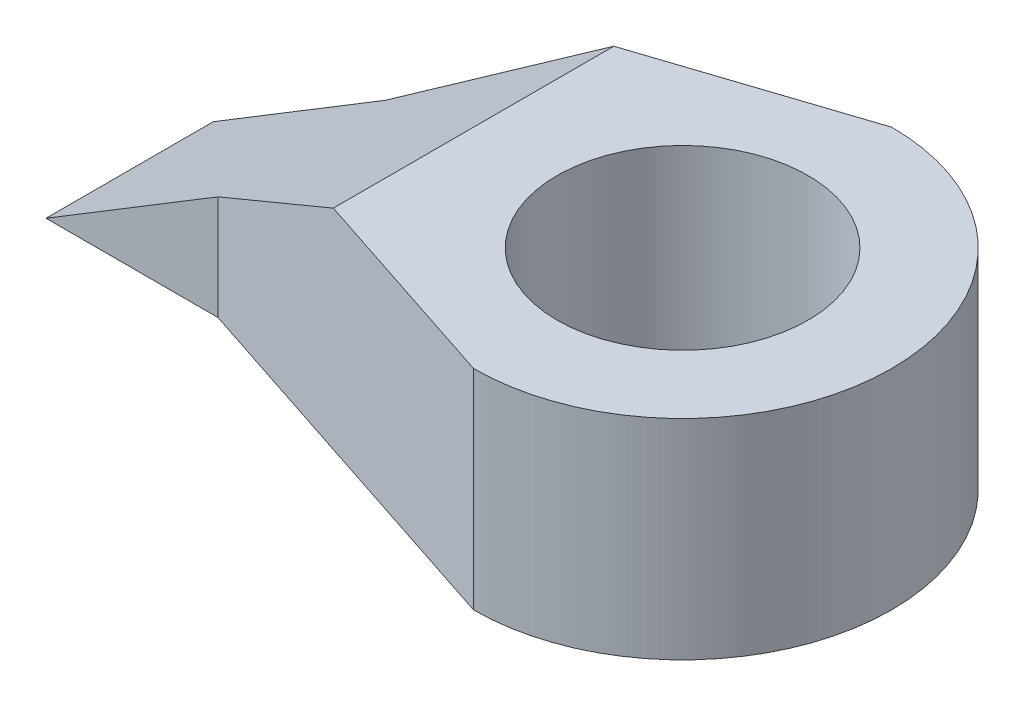
ISO-10303-21;
HEADER;
FILE_DESCRIPTION(('STEP AP214'),'2;1');
FILE_NAME('part.step','',(''),(''),'','','');
FILE_SCHEMA(('AUTOMOTIVE_DESIGN { 1 0 10303 214 1 1 1 1 }'));
ENDSEC;
DATA;
#1=APPLICATION_CONTEXT('core data for automotive mechanical design processes');
#2=APPLICATION_PROTOCOL_DEFINITION('international standard','automotive_design',2000,#1);
#3=PRODUCT_CONTEXT('',#1,'mechanical');
#4=PRODUCT('Part','Part','',(#3));
#5=PRODUCT_RELATED_PRODUCT_CATEGORY('part','',(#4));
#6=PRODUCT_DEFINITION_FORMATION('','',#4);
#7=PRODUCT_DEFINITION_CONTEXT('part definition',#1,'design');
#8=PRODUCT_DEFINITION('design','',#6,#7);
#9=PRODUCT_DEFINITION_SHAPE('','',#8);
#10=(LENGTH_UNIT() NAMED_UNIT(*) SI_UNIT(.MILLI.,.METRE.));
#11=(NAMED_UNIT(*) PLANE_ANGLE_UNIT() SI_UNIT($,.RADIAN.));
#12=(NAMED_UNIT(*) SI_UNIT($,.STERADIAN.) SOLID_ANGLE_UNIT());
#13=UNCERTAINTY_MEASURE_WITH_UNIT(LENGTH_MEASURE(1.E-05),#10,'distance_accuracy_value','');
#14=(GEOMETRIC_REPRESENTATION_CONTEXT(3) GLOBAL_UNCERTAINTY_ASSIGNED_CONTEXT((#13)) GLOBAL_UNIT_ASSIGNED_CONTEXT((#10,
#11,#12)) REPRESENTATION_CONTEXT('',''));
#15=CARTESIAN_POINT('',(0.,0.,0.));
#16=DIRECTION('',(0.,0.,1.));
#17=DIRECTION('',(1.,0.,0.));
#18=AXIS2_PLACEMENT_3D('',#15,#16,#17);
#19=CARTESIAN_POINT('',(13.2266009852217,5.,7.));
#20=DIRECTION('',(0.312682848974804,0.,-0.949857587197681));
#21=DIRECTION('',(-0.949857587197681,0.,-0.312682848974804));
#22=AXIS2_PLACEMENT_3D('',#19,#20,#21);
#23=PLANE('',#22);
#24=DIRECTION('',(-0.822615623796339,-0.499972968954063,-0.270796170211876));
#25=VECTOR('',#24,1.);
#26=CARTESIAN_POINT('',(8.59347657538926,5.22298127186832,5.47482553211462));
#27=LINE('',#26,#25);
#28=CARTESIAN_POINT('',(8.22660098522168,5.,5.35405405405406));
#29=VERTEX_POINT('',#28);
#30=CARTESIAN_POINT('',(4.11330049261084,2.5,4.));
#31=VERTEX_POINT('',#30);
#32=EDGE_CURVE('E83',#29,#31,#27,.T.);
#33=ORIENTED_EDGE('',*,*,#32,.T.);
#34=DIRECTION('',(0.,1.,0.));
#35=VECTOR('',#34,1.);
#36=CARTESIAN_POINT('',(4.11330049261084,0.,4.));
#37=LINE('',#36,#35);
#38=CARTESIAN_POINT('',(4.11330049261084,0.,4.));
#39=VERTEX_POINT('',#38);
#40=EDGE_CURVE('E11',#39,#31,#37,.T.);
#41=ORIENTED_EDGE('',*,*,#40,.F.);
#42=DIRECTION('',(0.949857587197681,0.,0.312682848974804));
#43=VECTOR('',#42,1.);
#44=CARTESIAN_POINT('',(13.2266009852217,0.,7.));
#45=LINE('',#44,#43);
#46=CARTESIAN_POINT('',(13.2266009852217,0.,7.));
#47=VERTEX_POINT('',#46);
#48=EDGE_CURVE('E123',#39,#47,#45,.T.);
#49=ORIENTED_EDGE('',*,*,#48,.T.);
#50=DIRECTION('',(0.,-1.,0.));
#51=VECTOR('',#50,1.);
#52=CARTESIAN_POINT('',(13.2266009852217,5.,7.));
#53=LINE('',#52,#51);
#54=CARTESIAN_POINT('',(13.2266009852217,5.,7.));
#55=VERTEX_POINT('',#54);
#56=EDGE_CURVE('E135',#55,#47,#53,.T.);
#57=ORIENTED_EDGE('',*,*,#56,.F.);
#58=DIRECTION('',(0.949857587197681,0.,0.312682848974804));
#59=VECTOR('',#58,1.);
#60=CARTESIAN_POINT('',(13.2266009852217,5.,7.));
#61=LINE('',#60,#59);
#62=EDGE_CURVE('E86',#29,#55,#61,.T.);
#63=ORIENTED_EDGE('',*,*,#62,.F.);
#64=EDGE_LOOP('',(#33,#41,#49,#57,#63));
#65=FACE_BOUND('',#64,.T.);
#66=ADVANCED_FACE('F33',(#65),#23,.F.);
#67=CARTESIAN_POINT('',(13.2266009852217,5.,2.));
#68=DIRECTION('',(0.,1.,0.));
#69=DIRECTION('',(0.,0.,1.));
#70=AXIS2_PLACEMENT_3D('',#67,#68,#69);
#71=PLANE('',#70);
#72=CARTESIAN_POINT('',(13.2266009852217,5.,2.));
#73=DIRECTION('',(0.,1.,0.));
#74=DIRECTION('',(0.,0.,1.));
#75=AXIS2_PLACEMENT_3D('',#72,#73,#74);
#76=CIRCLE('',#75,3.);
#77=CARTESIAN_POINT('',(13.2266009852217,5.,5.));
#78=VERTEX_POINT('',#77);
#79=EDGE_CURVE('E146',#78,#78,#76,.T.);
#80=ORIENTED_EDGE('',*,*,#79,.F.);
#81=EDGE_LOOP('',(#80));
#82=FACE_BOUND('',#81,.T.);
#83=DIRECTION('',(0.,0.,-1.));
#84=VECTOR('',#83,1.);
#85=CARTESIAN_POINT('',(8.22660098522168,5.,4.));
#86=LINE('',#85,#84);
#87=CARTESIAN_POINT('',(8.22660098522168,5.,-1.35405405405405));
#88=VERTEX_POINT('',#87);
#89=EDGE_CURVE('E98',#29,#88,#86,.T.);
#90=ORIENTED_EDGE('',*,*,#89,.F.);
#91=ORIENTED_EDGE('',*,*,#62,.T.);
#92=CARTESIAN_POINT('',(13.2266009852217,5.,2.));
#93=DIRECTION('',(0.,1.,0.));
#94=DIRECTION('',(0.,0.,1.));
#95=AXIS2_PLACEMENT_3D('',#92,#93,#94);
#96=CIRCLE('',#95,5.);
#97=CARTESIAN_POINT('',(13.2266009852217,5.,-3.));
#98=VERTEX_POINT('',#97);
#99=EDGE_CURVE('E127',#55,#98,#96,.T.);
#100=ORIENTED_EDGE('',*,*,#99,.T.);
#101=DIRECTION('',(-0.949857587197681,0.,0.312682848974804));
#102=VECTOR('',#101,1.);
#103=CARTESIAN_POINT('',(13.2266009852217,5.,-3.));
#104=LINE('',#103,#102);
#105=EDGE_CURVE('E130',#98,#88,#104,.T.);
#106=ORIENTED_EDGE('',*,*,#105,.T.);
#107=EDGE_LOOP('',(#90,#91,#100,#106));
#108=FACE_BOUND('',#107,.T.);
#109=ADVANCED_FACE('F153',(#82,#108),#71,.T.);
#110=CARTESIAN_POINT('',(13.2266009852217,5.,2.));
#111=DIRECTION('',(0.,-1.,0.));
#112=DIRECTION('',(0.,0.,-1.));
#113=AXIS2_PLACEMENT_3D('',#110,#111,#112);
#114=CYLINDRICAL_SURFACE('',#113,5.);
#115=CARTESIAN_POINT('',(13.2266009852217,0.,2.));
#116=DIRECTION('',(0.,1.,0.));
#117=DIRECTION('',(0.,0.,1.));
#118=AXIS2_PLACEMENT_3D('',#115,#116,#117);
#119=CIRCLE('',#118,5.);
#120=CARTESIAN_POINT('',(13.2266009852217,0.,-3.));
#121=VERTEX_POINT('',#120);
#122=EDGE_CURVE('E125',#47,#121,#119,.T.);
#123=ORIENTED_EDGE('',*,*,#122,.T.);
#124=DIRECTION('',(0.,-1.,0.));
#125=VECTOR('',#124,1.);
#126=CARTESIAN_POINT('',(13.2266009852217,5.,-3.));
#127=LINE('',#126,#125);
#128=EDGE_CURVE('E107',#98,#121,#127,.T.);
#129=ORIENTED_EDGE('',*,*,#128,.F.);
#130=ORIENTED_EDGE('',*,*,#99,.F.);
#131=ORIENTED_EDGE('',*,*,#56,.T.);
#132=EDGE_LOOP('',(#123,#129,#130,#131));
#133=FACE_BOUND('',#132,.T.);
#134=ADVANCED_FACE('F139',(#133),#114,.T.);
#135=CARTESIAN_POINT('',(13.2266009852217,5.,-3.));
#136=DIRECTION('',(0.312682848974804,0.,0.949857587197681));
#137=DIRECTION('',(0.949857587197681,0.,-0.312682848974804));
#138=AXIS2_PLACEMENT_3D('',#135,#136,#137);
#139=PLANE('',#138);
#140=DIRECTION('',(0.,1.,0.));
#141=VECTOR('',#140,1.);
#142=CARTESIAN_POINT('',(4.11330049261084,0.,0.));
#143=LINE('',#142,#141);
#144=CARTESIAN_POINT('',(4.11330049261084,0.,0.));
#145=VERTEX_POINT('',#144);
#146=CARTESIAN_POINT('',(4.11330049261084,2.5,0.));
#147=VERTEX_POINT('',#146);
#148=EDGE_CURVE('E42',#145,#147,#143,.T.);
#149=ORIENTED_EDGE('',*,*,#148,.T.);
#150=DIRECTION('',(-0.822615623796339,-0.499972968954063,0.270796170211876));
#151=VECTOR('',#150,1.);
#152=CARTESIAN_POINT('',(8.59347657538926,5.22298127186832,-1.47482553211462));
#153=LINE('',#152,#151);
#154=EDGE_CURVE('E88',#88,#147,#153,.T.);
#155=ORIENTED_EDGE('',*,*,#154,.F.);
#156=ORIENTED_EDGE('',*,*,#105,.F.);
#157=ORIENTED_EDGE('',*,*,#128,.T.);
#158=DIRECTION('',(-0.949857587197681,0.,0.312682848974804));
#159=VECTOR('',#158,1.);
#160=CARTESIAN_POINT('',(13.2266009852217,0.,-3.));
#161=LINE('',#160,#159);
#162=EDGE_CURVE('E117',#121,#145,#161,.T.);
#163=ORIENTED_EDGE('',*,*,#162,.T.);
#164=EDGE_LOOP('',(#149,#155,#156,#157,#163));
#165=FACE_BOUND('',#164,.T.);
#166=ADVANCED_FACE('F114',(#165),#139,.F.);
#167=CARTESIAN_POINT('',(0.,0.,4.));
#168=DIRECTION('',(0.,0.,1.));
#169=DIRECTION('',(1.,0.,0.));
#170=AXIS2_PLACEMENT_3D('',#167,#168,#169);
#171=PLANE('',#170);
#172=DIRECTION('',(1.,0.,0.));
#173=VECTOR('',#172,1.);
#174=CARTESIAN_POINT('',(8.22660098522168,0.,4.));
#175=LINE('',#174,#173);
#176=CARTESIAN_POINT('',(0.,0.,4.));
#177=VERTEX_POINT('',#176);
#178=EDGE_CURVE('E93',#177,#39,#175,.T.);
#179=ORIENTED_EDGE('',*,*,#178,.T.);
#180=ORIENTED_EDGE('',*,*,#40,.T.);
#181=DIRECTION('',(-0.85454420738555,-0.519378664967864,0.));
#182=VECTOR('',#181,1.);
#183=CARTESIAN_POINT('',(0.,0.,4.));
#184=LINE('',#183,#182);
#185=EDGE_CURVE('E47',#31,#177,#184,.T.);
#186=ORIENTED_EDGE('',*,*,#185,.T.);
#187=EDGE_LOOP('',(#179,#180,#186));
#188=FACE_BOUND('',#187,.T.);
#189=ADVANCED_FACE('F91',(#188),#171,.T.);
#190=CARTESIAN_POINT('',(0.,0.,0.));
#191=DIRECTION('',(0.,0.,1.));
#192=DIRECTION('',(1.,0.,0.));
#193=AXIS2_PLACEMENT_3D('',#190,#191,#192);
#194=PLANE('',#193);
#195=ORIENTED_EDGE('',*,*,#148,.F.);
#196=DIRECTION('',(1.,0.,0.));
#197=VECTOR('',#196,1.);
#198=CARTESIAN_POINT('',(8.22660098522168,0.,0.));
#199=LINE('',#198,#197);
#200=CARTESIAN_POINT('',(0.,0.,0.));
#201=VERTEX_POINT('',#200);
#202=EDGE_CURVE('E104',#201,#145,#199,.T.);
#203=ORIENTED_EDGE('',*,*,#202,.F.);
#204=DIRECTION('',(-0.85454420738555,-0.519378664967864,0.));
#205=VECTOR('',#204,1.);
#206=CARTESIAN_POINT('',(0.,0.,0.));
#207=LINE('',#206,#205);
#208=EDGE_CURVE('E100',#147,#201,#207,.T.);
#209=ORIENTED_EDGE('',*,*,#208,.F.);
#210=EDGE_LOOP('',(#195,#203,#209));
#211=FACE_BOUND('',#210,.T.);
#212=ADVANCED_FACE('F120',(#211),#194,.F.);
#213=CARTESIAN_POINT('',(8.22660098522168,0.,4.));
#214=DIRECTION('',(0.,1.,0.));
#215=DIRECTION('',(0.,0.,1.));
#216=AXIS2_PLACEMENT_3D('',#213,#214,#215);
#217=PLANE('',#216);
#218=CARTESIAN_POINT('',(13.2266009852217,0.,2.));
#219=DIRECTION('',(0.,1.,0.));
#220=DIRECTION('',(0.,0.,1.));
#221=AXIS2_PLACEMENT_3D('',#218,#219,#220);
#222=CIRCLE('',#221,3.);
#223=CARTESIAN_POINT('',(13.2266009852217,0.,5.));
#224=VERTEX_POINT('',#223);
#225=EDGE_CURVE('E89',#224,#224,#222,.F.);
#226=ORIENTED_EDGE('',*,*,#225,.F.);
#227=EDGE_LOOP('',(#226));
#228=FACE_BOUND('',#227,.T.);
#229=ORIENTED_EDGE('',*,*,#48,.F.);
#230=ORIENTED_EDGE('',*,*,#178,.F.);
#231=DIRECTION('',(0.,0.,-1.));
#232=VECTOR('',#231,1.);
#233=CARTESIAN_POINT('',(0.,0.,4.));
#234=LINE('',#233,#232);
#235=EDGE_CURVE('E96',#177,#201,#234,.T.);
#236=ORIENTED_EDGE('',*,*,#235,.T.);
#237=ORIENTED_EDGE('',*,*,#202,.T.);
#238=ORIENTED_EDGE('',*,*,#162,.F.);
#239=ORIENTED_EDGE('',*,*,#122,.F.);
#240=EDGE_LOOP('',(#229,#230,#236,#237,#238,#239));
#241=FACE_BOUND('',#240,.T.);
#242=ADVANCED_FACE('F35',(#228,#241),#217,.F.);
#243=CARTESIAN_POINT('',(0.,0.,4.));
#244=DIRECTION('',(0.519378664967864,-0.854544207385551,0.));
#245=DIRECTION('',(0.854544207385551,0.519378664967864,0.));
#246=AXIS2_PLACEMENT_3D('',#243,#244,#245);
#247=PLANE('',#246);
#248=ORIENTED_EDGE('',*,*,#89,.T.);
#249=ORIENTED_EDGE('',*,*,#154,.T.);
#250=ORIENTED_EDGE('',*,*,#208,.T.);
#251=ORIENTED_EDGE('',*,*,#235,.F.);
#252=ORIENTED_EDGE('',*,*,#185,.F.);
#253=ORIENTED_EDGE('',*,*,#32,.F.);
#254=EDGE_LOOP('',(#248,#249,#250,#251,#252,#253));
#255=FACE_BOUND('',#254,.T.);
#256=ADVANCED_FACE('F94',(#255),#247,.F.);
#257=CARTESIAN_POINT('',(13.2266009852217,-0.00100000000000013,2.));
#258=DIRECTION('',(0.,1.,0.));
#259=DIRECTION('',(0.,0.,1.));
#260=AXIS2_PLACEMENT_3D('',#257,#258,#259);
#261=CYLINDRICAL_SURFACE('',#260,3.);
#262=ORIENTED_EDGE('',*,*,#79,.T.);
#263=EDGE_LOOP('',(#262));
#264=FACE_BOUND('',#263,.T.);
#265=ORIENTED_EDGE('',*,*,#225,.T.);
#266=EDGE_LOOP('',(#265));
#267=FACE_BOUND('',#266,.T.);
#268=ADVANCED_FACE('F150',(#264,#267),#261,.F.);
#269=CLOSED_SHELL('',(#66,#109,#134,#166,#189,#212,#242,#256,#268));
#270=MANIFOLD_SOLID_BREP('B2',#269);
#271=ADVANCED_BREP_SHAPE_REPRESENTATION('',(#18,#270),#14);
#272=SHAPE_DEFINITION_REPRESENTATION(#9,#271);
ENDSEC;
END-ISO-10303-21;
